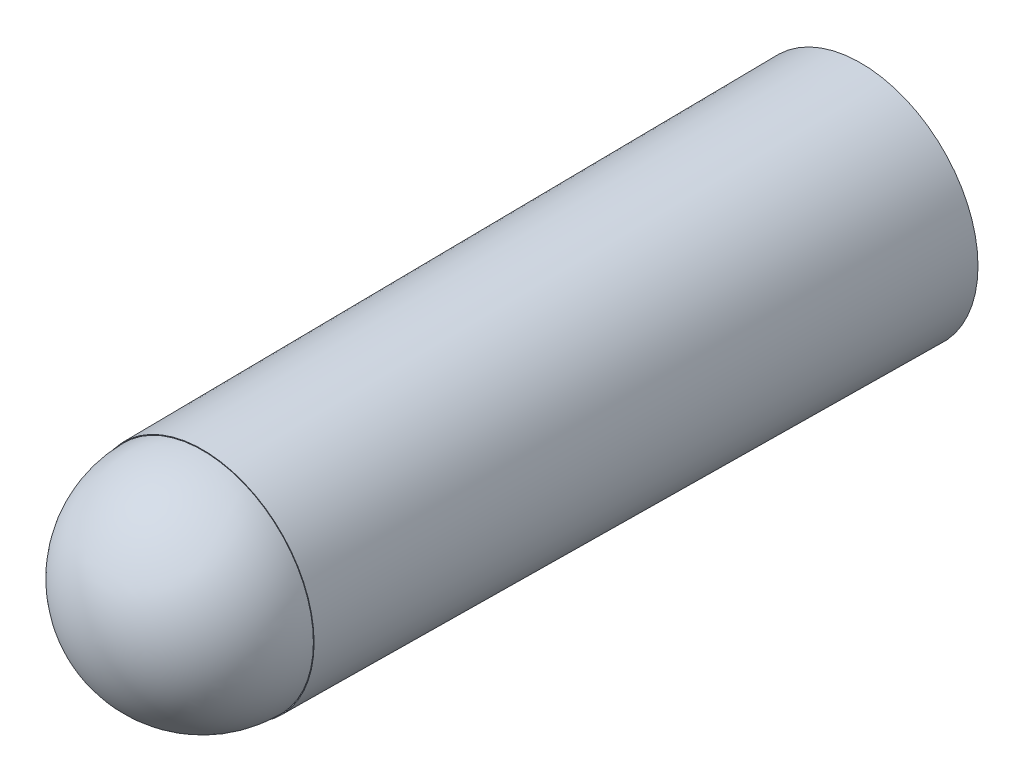
ISO-10303-21;
HEADER;
FILE_DESCRIPTION(('STEP AP214'),'2;1');
FILE_NAME('part.step','',(''),(''),'','','');
FILE_SCHEMA(('AUTOMOTIVE_DESIGN { 1 0 10303 214 1 1 1 1 }'));
ENDSEC;
DATA;
#1=APPLICATION_CONTEXT('core data for automotive mechanical design processes');
#2=APPLICATION_PROTOCOL_DEFINITION('international standard','automotive_design',2000,#1);
#3=PRODUCT_CONTEXT('',#1,'mechanical');
#4=PRODUCT('Part','Part','',(#3));
#5=PRODUCT_RELATED_PRODUCT_CATEGORY('part','',(#4));
#6=PRODUCT_DEFINITION_FORMATION('','',#4);
#7=PRODUCT_DEFINITION_CONTEXT('part definition',#1,'design');
#8=PRODUCT_DEFINITION('design','',#6,#7);
#9=PRODUCT_DEFINITION_SHAPE('','',#8);
#10=(LENGTH_UNIT() NAMED_UNIT(*) SI_UNIT(.MILLI.,.METRE.));
#11=(NAMED_UNIT(*) PLANE_ANGLE_UNIT() SI_UNIT($,.RADIAN.));
#12=(NAMED_UNIT(*) SI_UNIT($,.STERADIAN.) SOLID_ANGLE_UNIT());
#13=UNCERTAINTY_MEASURE_WITH_UNIT(LENGTH_MEASURE(1.E-05),#10,'distance_accuracy_value','');
#14=(GEOMETRIC_REPRESENTATION_CONTEXT(3) GLOBAL_UNCERTAINTY_ASSIGNED_CONTEXT((#13)) GLOBAL_UNIT_ASSIGNED_CONTEXT((#10,
#11,#12)) REPRESENTATION_CONTEXT('',''));
#15=CARTESIAN_POINT('',(0.,0.,0.));
#16=DIRECTION('',(0.,0.,1.));
#17=DIRECTION('',(1.,0.,0.));
#18=AXIS2_PLACEMENT_3D('',#15,#16,#17);
#19=CARTESIAN_POINT('',(0.,0.,0.));
#20=DIRECTION('',(0.,0.,-1.));
#21=DIRECTION('',(1.,0.,0.));
#22=AXIS2_PLACEMENT_3D('',#19,#20,#21);
#23=CONICAL_SURFACE('',#22,44.55,0.00872664625997167);
#24=CARTESIAN_POINT('',(0.,0.,250.));
#25=DIRECTION('',(0.,0.,1.));
#26=DIRECTION('',(1.,0.,0.));
#27=AXIS2_PLACEMENT_3D('',#24,#25,#26);
#28=CIRCLE('',#27,42.3682830523103);
#29=CARTESIAN_POINT('',(42.3682830523103,0.,250.));
#30=VERTEX_POINT('',#29);
#31=EDGE_CURVE('E38',#30,#30,#28,.T.);
#32=ORIENTED_EDGE('',*,*,#31,.F.);
#33=EDGE_LOOP('',(#32));
#34=FACE_BOUND('',#33,.T.);
#35=CARTESIAN_POINT('',(0.,0.,0.));
#36=DIRECTION('',(0.,0.,1.));
#37=DIRECTION('',(1.,0.,0.));
#38=AXIS2_PLACEMENT_3D('',#35,#36,#37);
#39=CIRCLE('',#38,44.55);
#40=CARTESIAN_POINT('',(44.55,0.,0.));
#41=VERTEX_POINT('',#40);
#42=EDGE_CURVE('E42',#41,#41,#39,.T.);
#43=ORIENTED_EDGE('',*,*,#42,.T.);
#44=EDGE_LOOP('',(#43));
#45=FACE_BOUND('',#44,.T.);
#46=ADVANCED_FACE('F32',(#34,#45),#23,.T.);
#47=CARTESIAN_POINT('',(0.,0.,250.));
#48=DIRECTION('',(0.,0.,1.));
#49=DIRECTION('',(1.,0.,0.));
#50=AXIS2_PLACEMENT_3D('',#47,#48,#49);
#51=PLANE('',#50);
#52=CARTESIAN_POINT('',(0.,0.,250.));
#53=DIRECTION('',(0.,0.,1.));
#54=DIRECTION('',(1.,0.,0.));
#55=AXIS2_PLACEMENT_3D('',#52,#53,#54);
#56=CIRCLE('',#55,42.1064770185875);
#57=CARTESIAN_POINT('',(42.1064770185875,0.,250.));
#58=VERTEX_POINT('',#57);
#59=EDGE_CURVE('E10',#58,#58,#56,.T.);
#60=ORIENTED_EDGE('',*,*,#59,.F.);
#61=EDGE_LOOP('',(#60));
#62=FACE_BOUND('',#61,.T.);
#63=ORIENTED_EDGE('',*,*,#31,.T.);
#64=EDGE_LOOP('',(#63));
#65=FACE_BOUND('',#64,.T.);
#66=ADVANCED_FACE('F57',(#62,#65),#51,.T.);
#67=CARTESIAN_POINT('',(0.,0.,0.));
#68=DIRECTION('',(0.,0.,1.));
#69=DIRECTION('',(1.,0.,0.));
#70=AXIS2_PLACEMENT_3D('',#67,#68,#69);
#71=PLANE('',#70);
#72=CARTESIAN_POINT('',(0.,0.,0.));
#73=DIRECTION('',(0.,0.,1.));
#74=DIRECTION('',(1.,0.,0.));
#75=AXIS2_PLACEMENT_3D('',#72,#73,#74);
#76=CIRCLE('',#75,39.55);
#77=CARTESIAN_POINT('',(39.55,0.,0.));
#78=VERTEX_POINT('',#77);
#79=EDGE_CURVE('E47',#78,#78,#76,.F.);
#80=ORIENTED_EDGE('',*,*,#79,.F.);
#81=EDGE_LOOP('',(#80));
#82=FACE_BOUND('',#81,.T.);
#83=ORIENTED_EDGE('',*,*,#42,.F.);
#84=EDGE_LOOP('',(#83));
#85=FACE_BOUND('',#84,.T.);
#86=ADVANCED_FACE('F54',(#82,#85),#71,.F.);
#87=CARTESIAN_POINT('',(0.,0.,0.));
#88=DIRECTION('',(0.,1.,0.));
#89=DIRECTION('',(-1.,0.,0.));
#90=AXIS2_PLACEMENT_3D('',#87,#88,#89);
#91=SPHERICAL_SURFACE('',#90,39.55);
#92=CARTESIAN_POINT('',(0.,0.,0.));
#93=DIRECTION('',(0.,0.,1.));
#94=DIRECTION('',(1.,0.,0.));
#95=AXIS2_PLACEMENT_3D('',#92,#93,#94);
#96=SPHERICAL_SURFACE('',#95,39.55);
#97=ORIENTED_EDGE('',*,*,#79,.T.);
#98=EDGE_LOOP('',(#97));
#99=FACE_BOUND('',#98,.T.);
#100=ADVANCED_FACE('F52',(#99),#96,.F.);
#101=CARTESIAN_POINT('',(0.,0.,250.));
#102=DIRECTION('',(0.,1.,0.));
#103=DIRECTION('',(1.,0.,0.));
#104=AXIS2_PLACEMENT_3D('',#101,#102,#103);
#105=SPHERICAL_SURFACE('',#104,42.1064770185875);
#106=CARTESIAN_POINT('',(0.,0.,250.));
#107=DIRECTION('',(0.,0.,1.));
#108=DIRECTION('',(1.,0.,0.));
#109=AXIS2_PLACEMENT_3D('',#106,#107,#108);
#110=SPHERICAL_SURFACE('',#109,42.1064770185875);
#111=ORIENTED_EDGE('',*,*,#59,.T.);
#112=EDGE_LOOP('',(#111));
#113=FACE_BOUND('',#112,.T.);
#114=ADVANCED_FACE('F72',(#113),#110,.T.);
#115=CLOSED_SHELL('',(#46,#66,#86,#100,#114));
#116=MANIFOLD_SOLID_BREP('B2',#115);
#117=ADVANCED_BREP_SHAPE_REPRESENTATION('',(#18,#116),#14);
#118=SHAPE_DEFINITION_REPRESENTATION(#9,#117);
ENDSEC;
END-ISO-10303-21;
